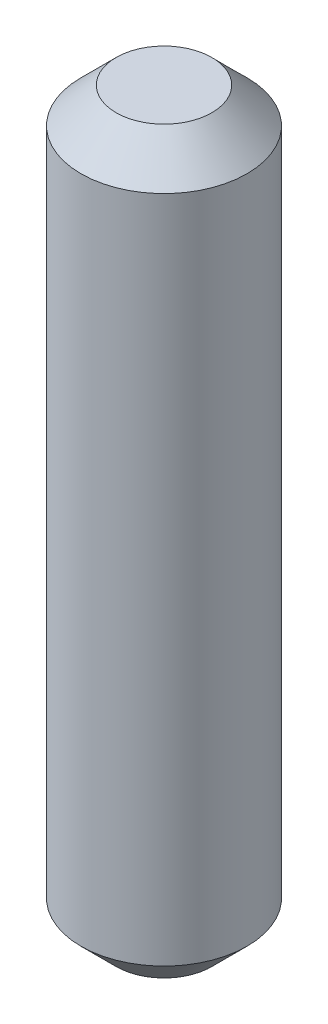
ISO-10303-21;
HEADER;
FILE_DESCRIPTION(('STEP AP214'),'2;1');
FILE_NAME('part.step','',(''),(''),'','','');
FILE_SCHEMA(('AUTOMOTIVE_DESIGN { 1 0 10303 214 1 1 1 1 }'));
ENDSEC;
DATA;
#1=APPLICATION_CONTEXT('core data for automotive mechanical design processes');
#2=APPLICATION_PROTOCOL_DEFINITION('international standard','automotive_design',2000,#1);
#3=PRODUCT_CONTEXT('',#1,'mechanical');
#4=PRODUCT('Part','Part','',(#3));
#5=PRODUCT_RELATED_PRODUCT_CATEGORY('part','',(#4));
#6=PRODUCT_DEFINITION_FORMATION('','',#4);
#7=PRODUCT_DEFINITION_CONTEXT('part definition',#1,'design');
#8=PRODUCT_DEFINITION('design','',#6,#7);
#9=PRODUCT_DEFINITION_SHAPE('','',#8);
#10=(LENGTH_UNIT() NAMED_UNIT(*) SI_UNIT(.MILLI.,.METRE.));
#11=(NAMED_UNIT(*) PLANE_ANGLE_UNIT() SI_UNIT($,.RADIAN.));
#12=(NAMED_UNIT(*) SI_UNIT($,.STERADIAN.) SOLID_ANGLE_UNIT());
#13=UNCERTAINTY_MEASURE_WITH_UNIT(LENGTH_MEASURE(1.E-05),#10,'distance_accuracy_value','');
#14=(GEOMETRIC_REPRESENTATION_CONTEXT(3) GLOBAL_UNCERTAINTY_ASSIGNED_CONTEXT((#13)) GLOBAL_UNIT_ASSIGNED_CONTEXT((#10,
#11,#12)) REPRESENTATION_CONTEXT('',''));
#15=CARTESIAN_POINT('',(0.,0.,0.));
#16=DIRECTION('',(0.,0.,1.));
#17=DIRECTION('',(1.,0.,0.));
#18=AXIS2_PLACEMENT_3D('',#15,#16,#17);
#19=CARTESIAN_POINT('',(0.,26.67,0.));
#20=DIRECTION('',(0.,-1.,0.));
#21=DIRECTION('',(0.,0.,-1.));
#22=AXIS2_PLACEMENT_3D('',#19,#20,#21);
#23=CYLINDRICAL_SURFACE('',#22,2.9972);
#24=CARTESIAN_POINT('',(0.,25.4,0.));
#25=DIRECTION('',(0.,1.,0.));
#26=DIRECTION('',(0.,0.,1.));
#27=AXIS2_PLACEMENT_3D('',#24,#25,#26);
#28=CIRCLE('',#27,2.9972);
#29=CARTESIAN_POINT('',(0.,25.4,2.9972));
#30=VERTEX_POINT('',#29);
#31=EDGE_CURVE('E50',#30,#30,#28,.F.);
#32=ORIENTED_EDGE('',*,*,#31,.T.);
#33=EDGE_LOOP('',(#32));
#34=FACE_BOUND('',#33,.T.);
#35=CARTESIAN_POINT('',(0.,1.26999999999999,0.));
#36=DIRECTION('',(0.,1.,0.));
#37=DIRECTION('',(0.,0.,1.));
#38=AXIS2_PLACEMENT_3D('',#35,#36,#37);
#39=CIRCLE('',#38,2.9972);
#40=CARTESIAN_POINT('',(0.,1.26999999999999,2.9972));
#41=VERTEX_POINT('',#40);
#42=EDGE_CURVE('E51',#41,#41,#39,.T.);
#43=ORIENTED_EDGE('',*,*,#42,.T.);
#44=EDGE_LOOP('',(#43));
#45=FACE_BOUND('',#44,.T.);
#46=ADVANCED_FACE('F39',(#34,#45),#23,.T.);
#47=CARTESIAN_POINT('',(0.,26.67,0.));
#48=DIRECTION('',(0.,1.,0.));
#49=DIRECTION('',(0.,0.,1.));
#50=AXIS2_PLACEMENT_3D('',#47,#48,#49);
#51=PLANE('',#50);
#52=CARTESIAN_POINT('',(0.,26.67,0.));
#53=DIRECTION('',(0.,1.,0.));
#54=DIRECTION('',(0.,0.,1.));
#55=AXIS2_PLACEMENT_3D('',#52,#53,#54);
#56=CIRCLE('',#55,1.7272);
#57=CARTESIAN_POINT('',(0.,26.67,1.7272));
#58=VERTEX_POINT('',#57);
#59=EDGE_CURVE('E54',#58,#58,#56,.T.);
#60=ORIENTED_EDGE('',*,*,#59,.T.);
#61=EDGE_LOOP('',(#60));
#62=FACE_BOUND('',#61,.T.);
#63=ADVANCED_FACE('F61',(#62),#51,.T.);
#64=CARTESIAN_POINT('',(0.,0.,0.));
#65=DIRECTION('',(0.,1.,0.));
#66=DIRECTION('',(0.,0.,1.));
#67=AXIS2_PLACEMENT_3D('',#64,#65,#66);
#68=PLANE('',#67);
#69=CARTESIAN_POINT('',(0.,0.,0.));
#70=DIRECTION('',(0.,1.,0.));
#71=DIRECTION('',(0.,0.,1.));
#72=AXIS2_PLACEMENT_3D('',#69,#70,#71);
#73=CIRCLE('',#72,1.7272);
#74=CARTESIAN_POINT('',(0.,0.,1.7272));
#75=VERTEX_POINT('',#74);
#76=EDGE_CURVE('E10',#75,#75,#73,.F.);
#77=ORIENTED_EDGE('',*,*,#76,.T.);
#78=EDGE_LOOP('',(#77));
#79=FACE_BOUND('',#78,.T.);
#80=ADVANCED_FACE('F64',(#79),#68,.F.);
#81=CARTESIAN_POINT('',(0.,26.67,0.));
#82=DIRECTION('',(0.,-1.,0.));
#83=DIRECTION('',(0.,0.,-1.));
#84=AXIS2_PLACEMENT_3D('',#81,#82,#83);
#85=CONICAL_SURFACE('',#84,1.7272,0.785398163397446);
#86=ORIENTED_EDGE('',*,*,#31,.F.);
#87=EDGE_LOOP('',(#86));
#88=FACE_BOUND('',#87,.T.);
#89=ORIENTED_EDGE('',*,*,#59,.F.);
#90=EDGE_LOOP('',(#89));
#91=FACE_BOUND('',#90,.T.);
#92=ADVANCED_FACE('F62',(#88,#91),#85,.T.);
#93=CARTESIAN_POINT('',(0.,1.26999999999999,0.));
#94=DIRECTION('',(0.,1.,0.));
#95=DIRECTION('',(0.,0.,1.));
#96=AXIS2_PLACEMENT_3D('',#93,#94,#95);
#97=CONICAL_SURFACE('',#96,2.9972,0.78539816339745);
#98=ORIENTED_EDGE('',*,*,#76,.F.);
#99=EDGE_LOOP('',(#98));
#100=FACE_BOUND('',#99,.T.);
#101=ORIENTED_EDGE('',*,*,#42,.F.);
#102=EDGE_LOOP('',(#101));
#103=FACE_BOUND('',#102,.T.);
#104=ADVANCED_FACE('F45',(#100,#103),#97,.T.);
#105=CLOSED_SHELL('',(#46,#63,#80,#92,#104));
#106=MANIFOLD_SOLID_BREP('B2',#105);
#107=ADVANCED_BREP_SHAPE_REPRESENTATION('',(#18,#106),#14);
#108=SHAPE_DEFINITION_REPRESENTATION(#9,#107);
ENDSEC;
END-ISO-10303-21;
